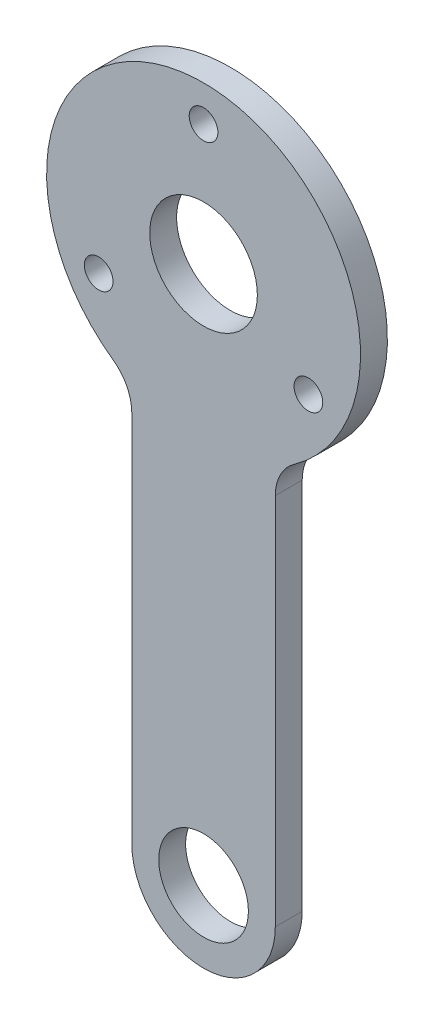
ISO-10303-21;
HEADER;
FILE_DESCRIPTION(('STEP AP214'),'2;1');
FILE_NAME('part.step','',(''),(''),'','','');
FILE_SCHEMA(('AUTOMOTIVE_DESIGN { 1 0 10303 214 1 1 1 1 }'));
ENDSEC;
DATA;
#1=APPLICATION_CONTEXT('core data for automotive mechanical design processes');
#2=APPLICATION_PROTOCOL_DEFINITION('international standard','automotive_design',2000,#1);
#3=PRODUCT_CONTEXT('',#1,'mechanical');
#4=PRODUCT('Part','Part','',(#3));
#5=PRODUCT_RELATED_PRODUCT_CATEGORY('part','',(#4));
#6=PRODUCT_DEFINITION_FORMATION('','',#4);
#7=PRODUCT_DEFINITION_CONTEXT('part definition',#1,'design');
#8=PRODUCT_DEFINITION('design','',#6,#7);
#9=PRODUCT_DEFINITION_SHAPE('','',#8);
#10=(LENGTH_UNIT() NAMED_UNIT(*) SI_UNIT(.MILLI.,.METRE.));
#11=(NAMED_UNIT(*) PLANE_ANGLE_UNIT() SI_UNIT($,.RADIAN.));
#12=(NAMED_UNIT(*) SI_UNIT($,.STERADIAN.) SOLID_ANGLE_UNIT());
#13=UNCERTAINTY_MEASURE_WITH_UNIT(LENGTH_MEASURE(1.E-05),#10,'distance_accuracy_value','');
#14=(GEOMETRIC_REPRESENTATION_CONTEXT(3) GLOBAL_UNCERTAINTY_ASSIGNED_CONTEXT((#13)) GLOBAL_UNIT_ASSIGNED_CONTEXT((#10,
#11,#12)) REPRESENTATION_CONTEXT('',''));
#15=CARTESIAN_POINT('',(0.,0.,0.));
#16=DIRECTION('',(0.,0.,1.));
#17=DIRECTION('',(1.,0.,0.));
#18=AXIS2_PLACEMENT_3D('',#15,#16,#17);
#19=CARTESIAN_POINT('',(13.,-18.364367672207,3.));
#20=DIRECTION('',(0.,0.,-1.));
#21=DIRECTION('',(-1.,0.,0.));
#22=AXIS2_PLACEMENT_3D('',#19,#20,#21);
#23=PLANE('',#22);
#24=CARTESIAN_POINT('',(13.,-18.364367672207,3.));
#25=DIRECTION('',(0.,0.,-1.));
#26=DIRECTION('',(-1.,0.,0.));
#27=AXIS2_PLACEMENT_3D('',#24,#25,#26);
#28=CIRCLE('',#27,5.);
#29=CARTESIAN_POINT('',(8.00000000000001,-18.364367672207,3.));
#30=VERTEX_POINT('',#29);
#31=CARTESIAN_POINT('',(10.1111111111111,-14.2833970783832,3.));
#32=VERTEX_POINT('',#31);
#33=EDGE_CURVE('E133',#30,#32,#28,.T.);
#34=ORIENTED_EDGE('',*,*,#33,.T.);
#35=CARTESIAN_POINT('',(0.,0.,3.));
#36=DIRECTION('',(0.,0.,1.));
#37=DIRECTION('',(1.,0.,0.));
#38=AXIS2_PLACEMENT_3D('',#35,#36,#37);
#39=CIRCLE('',#38,17.5);
#40=CARTESIAN_POINT('',(-10.1111111111111,-14.2833970783832,3.));
#41=VERTEX_POINT('',#40);
#42=EDGE_CURVE('E91',#32,#41,#39,.T.);
#43=ORIENTED_EDGE('',*,*,#42,.T.);
#44=CARTESIAN_POINT('',(-13.,-18.364367672207,3.));
#45=DIRECTION('',(0.,0.,-1.));
#46=DIRECTION('',(1.,0.,0.));
#47=AXIS2_PLACEMENT_3D('',#44,#45,#46);
#48=CIRCLE('',#47,5.);
#49=CARTESIAN_POINT('',(-7.99999999999999,-18.364367672207,3.));
#50=VERTEX_POINT('',#49);
#51=EDGE_CURVE('E104',#41,#50,#48,.T.);
#52=ORIENTED_EDGE('',*,*,#51,.T.);
#53=DIRECTION('',(0.,-1.,0.));
#54=VECTOR('',#53,1.);
#55=CARTESIAN_POINT('',(-7.99999999999999,-60.,3.));
#56=LINE('',#55,#54);
#57=CARTESIAN_POINT('',(-7.99999999999999,-60.,3.));
#58=VERTEX_POINT('',#57);
#59=EDGE_CURVE('E98',#50,#58,#56,.T.);
#60=ORIENTED_EDGE('',*,*,#59,.T.);
#61=CARTESIAN_POINT('',(0.,-60.,3.));
#62=DIRECTION('',(0.,0.,1.));
#63=DIRECTION('',(1.,0.,0.));
#64=AXIS2_PLACEMENT_3D('',#61,#62,#63);
#65=CIRCLE('',#64,8.);
#66=CARTESIAN_POINT('',(8.00000000000001,-60.,3.));
#67=VERTEX_POINT('',#66);
#68=EDGE_CURVE('E102',#58,#67,#65,.T.);
#69=ORIENTED_EDGE('',*,*,#68,.T.);
#70=DIRECTION('',(0.,1.,0.));
#71=VECTOR('',#70,1.);
#72=CARTESIAN_POINT('',(8.00000000000001,-60.,3.));
#73=LINE('',#72,#71);
#74=EDGE_CURVE('E54',#67,#30,#73,.T.);
#75=ORIENTED_EDGE('',*,*,#74,.T.);
#76=EDGE_LOOP('',(#34,#43,#52,#60,#69,#75));
#77=FACE_BOUND('',#76,.T.);
#78=CARTESIAN_POINT('',(0.,13.5,3.));
#79=DIRECTION('',(0.,0.,1.));
#80=DIRECTION('',(1.,0.,0.));
#81=AXIS2_PLACEMENT_3D('',#78,#79,#80);
#82=CIRCLE('',#81,1.6);
#83=CARTESIAN_POINT('',(1.6,13.5,3.));
#84=VERTEX_POINT('',#83);
#85=EDGE_CURVE('E126',#84,#84,#82,.T.);
#86=ORIENTED_EDGE('',*,*,#85,.F.);
#87=EDGE_LOOP('',(#86));
#88=FACE_BOUND('',#87,.T.);
#89=CARTESIAN_POINT('',(0.,0.,3.));
#90=DIRECTION('',(0.,0.,1.));
#91=DIRECTION('',(1.,0.,0.));
#92=AXIS2_PLACEMENT_3D('',#89,#90,#91);
#93=CIRCLE('',#92,6.);
#94=CARTESIAN_POINT('',(6.,0.,3.));
#95=VERTEX_POINT('',#94);
#96=EDGE_CURVE('E207',#95,#95,#93,.T.);
#97=ORIENTED_EDGE('',*,*,#96,.F.);
#98=EDGE_LOOP('',(#97));
#99=FACE_BOUND('',#98,.T.);
#100=CARTESIAN_POINT('',(11.6913429510899,-6.75,3.));
#101=DIRECTION('',(0.,0.,1.));
#102=DIRECTION('',(1.,0.,0.));
#103=AXIS2_PLACEMENT_3D('',#100,#101,#102);
#104=CIRCLE('',#103,1.6);
#105=CARTESIAN_POINT('',(13.2913429510899,-6.75,3.));
#106=VERTEX_POINT('',#105);
#107=EDGE_CURVE('E201',#106,#106,#104,.T.);
#108=ORIENTED_EDGE('',*,*,#107,.F.);
#109=EDGE_LOOP('',(#108));
#110=FACE_BOUND('',#109,.T.);
#111=CARTESIAN_POINT('',(-11.6913429510899,-6.75000000000001,3.));
#112=DIRECTION('',(0.,0.,1.));
#113=DIRECTION('',(1.,0.,0.));
#114=AXIS2_PLACEMENT_3D('',#111,#112,#113);
#115=CIRCLE('',#114,1.6);
#116=CARTESIAN_POINT('',(-10.0913429510899,-6.75000000000001,3.));
#117=VERTEX_POINT('',#116);
#118=EDGE_CURVE('E195',#117,#117,#115,.T.);
#119=ORIENTED_EDGE('',*,*,#118,.F.);
#120=EDGE_LOOP('',(#119));
#121=FACE_BOUND('',#120,.T.);
#122=CARTESIAN_POINT('',(0.,-60.,3.));
#123=DIRECTION('',(0.,0.,1.));
#124=DIRECTION('',(1.,0.,0.));
#125=AXIS2_PLACEMENT_3D('',#122,#123,#124);
#126=CIRCLE('',#125,5.);
#127=CARTESIAN_POINT('',(5.00000000000001,-60.,3.));
#128=VERTEX_POINT('',#127);
#129=EDGE_CURVE('E186',#128,#128,#126,.T.);
#130=ORIENTED_EDGE('',*,*,#129,.F.);
#131=EDGE_LOOP('',(#130));
#132=FACE_BOUND('',#131,.T.);
#133=ADVANCED_FACE('F37',(#77,#88,#99,#110,#121,#132),#23,.F.);
#134=CARTESIAN_POINT('',(13.,-18.364367672207,0.));
#135=DIRECTION('',(0.,0.,-1.));
#136=DIRECTION('',(-1.,0.,0.));
#137=AXIS2_PLACEMENT_3D('',#134,#135,#136);
#138=PLANE('',#137);
#139=CARTESIAN_POINT('',(-11.6913429510899,-6.75000000000001,0.));
#140=DIRECTION('',(0.,0.,1.));
#141=DIRECTION('',(1.,0.,0.));
#142=AXIS2_PLACEMENT_3D('',#139,#140,#141);
#143=CIRCLE('',#142,1.6);
#144=CARTESIAN_POINT('',(-10.0913429510899,-6.75000000000001,0.));
#145=VERTEX_POINT('',#144);
#146=EDGE_CURVE('E192',#145,#145,#143,.T.);
#147=ORIENTED_EDGE('',*,*,#146,.T.);
#148=EDGE_LOOP('',(#147));
#149=FACE_BOUND('',#148,.T.);
#150=CARTESIAN_POINT('',(0.,0.,0.));
#151=DIRECTION('',(0.,0.,1.));
#152=DIRECTION('',(1.,0.,0.));
#153=AXIS2_PLACEMENT_3D('',#150,#151,#152);
#154=CIRCLE('',#153,6.);
#155=CARTESIAN_POINT('',(6.,0.,0.));
#156=VERTEX_POINT('',#155);
#157=EDGE_CURVE('E204',#156,#156,#154,.T.);
#158=ORIENTED_EDGE('',*,*,#157,.T.);
#159=EDGE_LOOP('',(#158));
#160=FACE_BOUND('',#159,.T.);
#161=CARTESIAN_POINT('',(13.,-18.364367672207,0.));
#162=DIRECTION('',(0.,0.,-1.));
#163=DIRECTION('',(-1.,0.,0.));
#164=AXIS2_PLACEMENT_3D('',#161,#162,#163);
#165=CIRCLE('',#164,5.);
#166=CARTESIAN_POINT('',(8.00000000000001,-18.364367672207,0.));
#167=VERTEX_POINT('',#166);
#168=CARTESIAN_POINT('',(10.1111111111111,-14.2833970783832,0.));
#169=VERTEX_POINT('',#168);
#170=EDGE_CURVE('E122',#167,#169,#165,.T.);
#171=ORIENTED_EDGE('',*,*,#170,.F.);
#172=DIRECTION('',(0.,1.,0.));
#173=VECTOR('',#172,1.);
#174=CARTESIAN_POINT('',(8.00000000000001,-60.,0.));
#175=LINE('',#174,#173);
#176=CARTESIAN_POINT('',(8.00000000000001,-60.,0.));
#177=VERTEX_POINT('',#176);
#178=EDGE_CURVE('E83',#177,#167,#175,.T.);
#179=ORIENTED_EDGE('',*,*,#178,.F.);
#180=CARTESIAN_POINT('',(0.,-60.,0.));
#181=DIRECTION('',(0.,0.,1.));
#182=DIRECTION('',(1.,0.,0.));
#183=AXIS2_PLACEMENT_3D('',#180,#181,#182);
#184=CIRCLE('',#183,8.);
#185=CARTESIAN_POINT('',(-7.99999999999999,-60.,0.));
#186=VERTEX_POINT('',#185);
#187=EDGE_CURVE('E77',#186,#177,#184,.T.);
#188=ORIENTED_EDGE('',*,*,#187,.F.);
#189=DIRECTION('',(0.,-1.,0.));
#190=VECTOR('',#189,1.);
#191=CARTESIAN_POINT('',(-7.99999999999999,-60.,0.));
#192=LINE('',#191,#190);
#193=CARTESIAN_POINT('',(-7.99999999999999,-18.364367672207,0.));
#194=VERTEX_POINT('',#193);
#195=EDGE_CURVE('E112',#194,#186,#192,.T.);
#196=ORIENTED_EDGE('',*,*,#195,.F.);
#197=CARTESIAN_POINT('',(-13.,-18.364367672207,0.));
#198=DIRECTION('',(0.,0.,-1.));
#199=DIRECTION('',(1.,0.,0.));
#200=AXIS2_PLACEMENT_3D('',#197,#198,#199);
#201=CIRCLE('',#200,5.);
#202=CARTESIAN_POINT('',(-10.1111111111111,-14.2833970783832,0.));
#203=VERTEX_POINT('',#202);
#204=EDGE_CURVE('E128',#203,#194,#201,.T.);
#205=ORIENTED_EDGE('',*,*,#204,.F.);
#206=CARTESIAN_POINT('',(0.,0.,0.));
#207=DIRECTION('',(0.,0.,1.));
#208=DIRECTION('',(1.,0.,0.));
#209=AXIS2_PLACEMENT_3D('',#206,#207,#208);
#210=CIRCLE('',#209,17.5);
#211=EDGE_CURVE('E125',#169,#203,#210,.T.);
#212=ORIENTED_EDGE('',*,*,#211,.F.);
#213=EDGE_LOOP('',(#171,#179,#188,#196,#205,#212));
#214=FACE_BOUND('',#213,.T.);
#215=CARTESIAN_POINT('',(0.,13.5,0.));
#216=DIRECTION('',(0.,0.,1.));
#217=DIRECTION('',(1.,0.,0.));
#218=AXIS2_PLACEMENT_3D('',#215,#216,#217);
#219=CIRCLE('',#218,1.6);
#220=CARTESIAN_POINT('',(1.6,13.5,0.));
#221=VERTEX_POINT('',#220);
#222=EDGE_CURVE('E210',#221,#221,#219,.T.);
#223=ORIENTED_EDGE('',*,*,#222,.T.);
#224=EDGE_LOOP('',(#223));
#225=FACE_BOUND('',#224,.T.);
#226=CARTESIAN_POINT('',(11.6913429510899,-6.75,0.));
#227=DIRECTION('',(0.,0.,1.));
#228=DIRECTION('',(1.,0.,0.));
#229=AXIS2_PLACEMENT_3D('',#226,#227,#228);
#230=CIRCLE('',#229,1.6);
#231=CARTESIAN_POINT('',(13.2913429510899,-6.75,0.));
#232=VERTEX_POINT('',#231);
#233=EDGE_CURVE('E198',#232,#232,#230,.T.);
#234=ORIENTED_EDGE('',*,*,#233,.T.);
#235=EDGE_LOOP('',(#234));
#236=FACE_BOUND('',#235,.T.);
#237=CARTESIAN_POINT('',(0.,-60.,0.));
#238=DIRECTION('',(0.,0.,1.));
#239=DIRECTION('',(1.,0.,0.));
#240=AXIS2_PLACEMENT_3D('',#237,#238,#239);
#241=CIRCLE('',#240,5.);
#242=CARTESIAN_POINT('',(5.00000000000001,-60.,0.));
#243=VERTEX_POINT('',#242);
#244=EDGE_CURVE('E189',#243,#243,#241,.T.);
#245=ORIENTED_EDGE('',*,*,#244,.T.);
#246=EDGE_LOOP('',(#245));
#247=FACE_BOUND('',#246,.T.);
#248=ADVANCED_FACE('F142',(#149,#160,#214,#225,#236,#247),#138,.T.);
#249=CARTESIAN_POINT('',(13.,-18.364367672207,3.));
#250=DIRECTION('',(0.,0.,-1.));
#251=DIRECTION('',(-1.,0.,0.));
#252=AXIS2_PLACEMENT_3D('',#249,#250,#251);
#253=CYLINDRICAL_SURFACE('',#252,5.);
#254=ORIENTED_EDGE('',*,*,#170,.T.);
#255=DIRECTION('',(0.,0.,-1.));
#256=VECTOR('',#255,1.);
#257=CARTESIAN_POINT('',(10.1111111111111,-14.2833970783832,3.));
#258=LINE('',#257,#256);
#259=EDGE_CURVE('E11',#32,#169,#258,.T.);
#260=ORIENTED_EDGE('',*,*,#259,.F.);
#261=ORIENTED_EDGE('',*,*,#33,.F.);
#262=DIRECTION('',(0.,0.,-1.));
#263=VECTOR('',#262,1.);
#264=CARTESIAN_POINT('',(8.00000000000001,-18.364367672207,3.));
#265=LINE('',#264,#263);
#266=EDGE_CURVE('E118',#30,#167,#265,.T.);
#267=ORIENTED_EDGE('',*,*,#266,.T.);
#268=EDGE_LOOP('',(#254,#260,#261,#267));
#269=FACE_BOUND('',#268,.T.);
#270=ADVANCED_FACE('F39',(#269),#253,.F.);
#271=CARTESIAN_POINT('',(0.,0.,3.));
#272=DIRECTION('',(0.,0.,-1.));
#273=DIRECTION('',(-1.,0.,0.));
#274=AXIS2_PLACEMENT_3D('',#271,#272,#273);
#275=CYLINDRICAL_SURFACE('',#274,17.5);
#276=ORIENTED_EDGE('',*,*,#211,.T.);
#277=DIRECTION('',(0.,0.,-1.));
#278=VECTOR('',#277,1.);
#279=CARTESIAN_POINT('',(-10.1111111111111,-14.2833970783832,3.));
#280=LINE('',#279,#278);
#281=EDGE_CURVE('E46',#41,#203,#280,.T.);
#282=ORIENTED_EDGE('',*,*,#281,.F.);
#283=ORIENTED_EDGE('',*,*,#42,.F.);
#284=ORIENTED_EDGE('',*,*,#259,.T.);
#285=EDGE_LOOP('',(#276,#282,#283,#284));
#286=FACE_BOUND('',#285,.T.);
#287=ADVANCED_FACE('F271',(#286),#275,.T.);
#288=CARTESIAN_POINT('',(-13.,-18.364367672207,3.));
#289=DIRECTION('',(0.,0.,-1.));
#290=DIRECTION('',(-1.,0.,0.));
#291=AXIS2_PLACEMENT_3D('',#288,#289,#290);
#292=CYLINDRICAL_SURFACE('',#291,5.);
#293=ORIENTED_EDGE('',*,*,#204,.T.);
#294=DIRECTION('',(0.,0.,-1.));
#295=VECTOR('',#294,1.);
#296=CARTESIAN_POINT('',(-7.99999999999999,-18.364367672207,3.));
#297=LINE('',#296,#295);
#298=EDGE_CURVE('E113',#50,#194,#297,.T.);
#299=ORIENTED_EDGE('',*,*,#298,.F.);
#300=ORIENTED_EDGE('',*,*,#51,.F.);
#301=ORIENTED_EDGE('',*,*,#281,.T.);
#302=EDGE_LOOP('',(#293,#299,#300,#301));
#303=FACE_BOUND('',#302,.T.);
#304=ADVANCED_FACE('F139',(#303),#292,.F.);
#305=CARTESIAN_POINT('',(-7.99999999999999,-60.,3.));
#306=DIRECTION('',(1.,0.,0.));
#307=DIRECTION('',(0.,0.,-1.));
#308=AXIS2_PLACEMENT_3D('',#305,#306,#307);
#309=PLANE('',#308);
#310=ORIENTED_EDGE('',*,*,#195,.T.);
#311=DIRECTION('',(0.,0.,-1.));
#312=VECTOR('',#311,1.);
#313=CARTESIAN_POINT('',(-7.99999999999999,-60.,3.));
#314=LINE('',#313,#312);
#315=EDGE_CURVE('E109',#58,#186,#314,.T.);
#316=ORIENTED_EDGE('',*,*,#315,.F.);
#317=ORIENTED_EDGE('',*,*,#59,.F.);
#318=ORIENTED_EDGE('',*,*,#298,.T.);
#319=EDGE_LOOP('',(#310,#316,#317,#318));
#320=FACE_BOUND('',#319,.T.);
#321=ADVANCED_FACE('F110',(#320),#309,.F.);
#322=CARTESIAN_POINT('',(0.,-60.,3.));
#323=DIRECTION('',(0.,0.,-1.));
#324=DIRECTION('',(-1.,0.,0.));
#325=AXIS2_PLACEMENT_3D('',#322,#323,#324);
#326=CYLINDRICAL_SURFACE('',#325,8.);
#327=ORIENTED_EDGE('',*,*,#187,.T.);
#328=DIRECTION('',(0.,0.,-1.));
#329=VECTOR('',#328,1.);
#330=CARTESIAN_POINT('',(8.00000000000001,-60.,3.));
#331=LINE('',#330,#329);
#332=EDGE_CURVE('E114',#67,#177,#331,.T.);
#333=ORIENTED_EDGE('',*,*,#332,.F.);
#334=ORIENTED_EDGE('',*,*,#68,.F.);
#335=ORIENTED_EDGE('',*,*,#315,.T.);
#336=EDGE_LOOP('',(#327,#333,#334,#335));
#337=FACE_BOUND('',#336,.T.);
#338=ADVANCED_FACE('F116',(#337),#326,.T.);
#339=CARTESIAN_POINT('',(8.00000000000001,-60.,3.));
#340=DIRECTION('',(-1.,0.,0.));
#341=DIRECTION('',(0.,0.,1.));
#342=AXIS2_PLACEMENT_3D('',#339,#340,#341);
#343=PLANE('',#342);
#344=ORIENTED_EDGE('',*,*,#178,.T.);
#345=ORIENTED_EDGE('',*,*,#266,.F.);
#346=ORIENTED_EDGE('',*,*,#74,.F.);
#347=ORIENTED_EDGE('',*,*,#332,.T.);
#348=EDGE_LOOP('',(#344,#345,#346,#347));
#349=FACE_BOUND('',#348,.T.);
#350=ADVANCED_FACE('F147',(#349),#343,.F.);
#351=CARTESIAN_POINT('',(0.,13.5,3.));
#352=DIRECTION('',(0.,0.,-1.));
#353=DIRECTION('',(-1.,0.,0.));
#354=AXIS2_PLACEMENT_3D('',#351,#352,#353);
#355=CYLINDRICAL_SURFACE('',#354,1.6);
#356=ORIENTED_EDGE('',*,*,#85,.T.);
#357=EDGE_LOOP('',(#356));
#358=FACE_BOUND('',#357,.T.);
#359=ORIENTED_EDGE('',*,*,#222,.F.);
#360=EDGE_LOOP('',(#359));
#361=FACE_BOUND('',#360,.T.);
#362=ADVANCED_FACE('F149',(#358,#361),#355,.F.);
#363=CARTESIAN_POINT('',(0.,0.,3.));
#364=DIRECTION('',(0.,0.,-1.));
#365=DIRECTION('',(-1.,0.,0.));
#366=AXIS2_PLACEMENT_3D('',#363,#364,#365);
#367=CYLINDRICAL_SURFACE('',#366,6.);
#368=ORIENTED_EDGE('',*,*,#96,.T.);
#369=EDGE_LOOP('',(#368));
#370=FACE_BOUND('',#369,.T.);
#371=ORIENTED_EDGE('',*,*,#157,.F.);
#372=EDGE_LOOP('',(#371));
#373=FACE_BOUND('',#372,.T.);
#374=ADVANCED_FACE('F155',(#370,#373),#367,.F.);
#375=CARTESIAN_POINT('',(11.6913429510899,-6.75,3.));
#376=DIRECTION('',(0.,0.,-1.));
#377=DIRECTION('',(-1.,0.,0.));
#378=AXIS2_PLACEMENT_3D('',#375,#376,#377);
#379=CYLINDRICAL_SURFACE('',#378,1.6);
#380=ORIENTED_EDGE('',*,*,#107,.T.);
#381=EDGE_LOOP('',(#380));
#382=FACE_BOUND('',#381,.T.);
#383=ORIENTED_EDGE('',*,*,#233,.F.);
#384=EDGE_LOOP('',(#383));
#385=FACE_BOUND('',#384,.T.);
#386=ADVANCED_FACE('F169',(#382,#385),#379,.F.);
#387=CARTESIAN_POINT('',(-11.6913429510899,-6.75000000000001,3.));
#388=DIRECTION('',(0.,0.,-1.));
#389=DIRECTION('',(-1.,0.,0.));
#390=AXIS2_PLACEMENT_3D('',#387,#388,#389);
#391=CYLINDRICAL_SURFACE('',#390,1.6);
#392=ORIENTED_EDGE('',*,*,#118,.T.);
#393=EDGE_LOOP('',(#392));
#394=FACE_BOUND('',#393,.T.);
#395=ORIENTED_EDGE('',*,*,#146,.F.);
#396=EDGE_LOOP('',(#395));
#397=FACE_BOUND('',#396,.T.);
#398=ADVANCED_FACE('F173',(#394,#397),#391,.F.);
#399=CARTESIAN_POINT('',(0.,-60.,3.));
#400=DIRECTION('',(0.,0.,-1.));
#401=DIRECTION('',(-1.,0.,0.));
#402=AXIS2_PLACEMENT_3D('',#399,#400,#401);
#403=CYLINDRICAL_SURFACE('',#402,5.);
#404=ORIENTED_EDGE('',*,*,#129,.T.);
#405=EDGE_LOOP('',(#404));
#406=FACE_BOUND('',#405,.T.);
#407=ORIENTED_EDGE('',*,*,#244,.F.);
#408=EDGE_LOOP('',(#407));
#409=FACE_BOUND('',#408,.T.);
#410=ADVANCED_FACE('F177',(#406,#409),#403,.F.);
#411=CLOSED_SHELL('',(#133,#248,#270,#287,#304,#321,#338,#350,#362,#374,#386,#398,#410));
#412=MANIFOLD_SOLID_BREP('B2',#411);
#413=ADVANCED_BREP_SHAPE_REPRESENTATION('',(#18,#412),#14);
#414=SHAPE_DEFINITION_REPRESENTATION(#9,#413);
ENDSEC;
END-ISO-10303-21;
